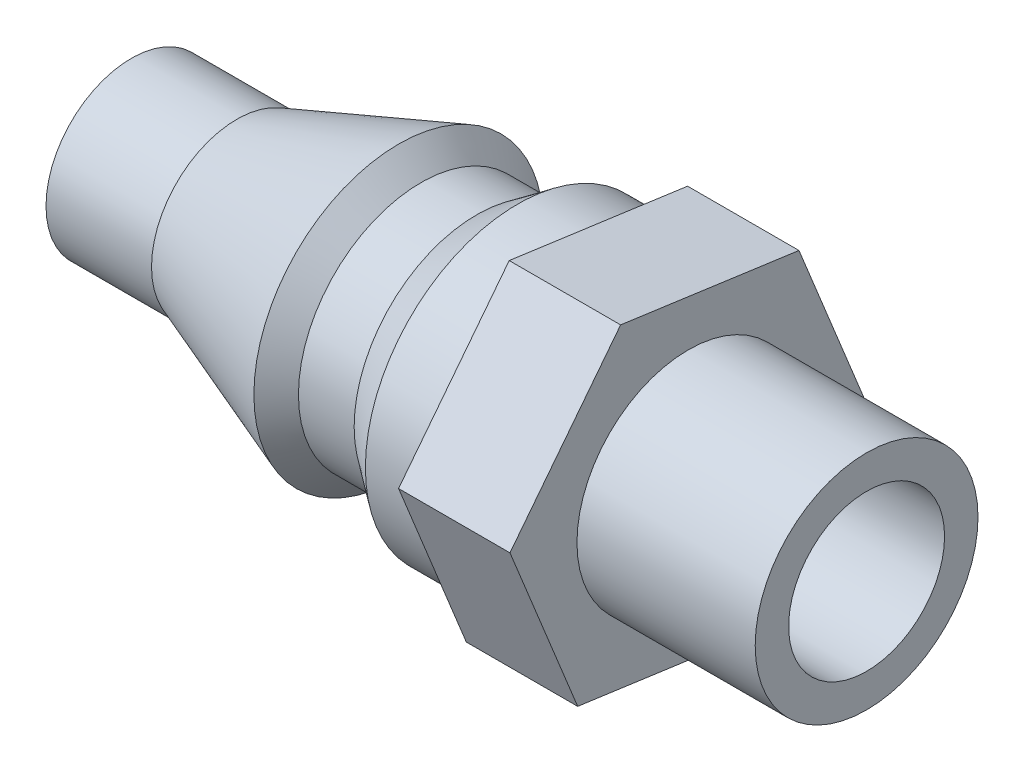
ISO-10303-21;
HEADER;
FILE_DESCRIPTION(('STEP AP214'),'2;1');
FILE_NAME('part.step','',(''),(''),'','','');
FILE_SCHEMA(('AUTOMOTIVE_DESIGN { 1 0 10303 214 1 1 1 1 }'));
ENDSEC;
DATA;
#1=APPLICATION_CONTEXT('core data for automotive mechanical design processes');
#2=APPLICATION_PROTOCOL_DEFINITION('international standard','automotive_design',2000,#1);
#3=PRODUCT_CONTEXT('',#1,'mechanical');
#4=PRODUCT('Part','Part','',(#3));
#5=PRODUCT_RELATED_PRODUCT_CATEGORY('part','',(#4));
#6=PRODUCT_DEFINITION_FORMATION('','',#4);
#7=PRODUCT_DEFINITION_CONTEXT('part definition',#1,'design');
#8=PRODUCT_DEFINITION('design','',#6,#7);
#9=PRODUCT_DEFINITION_SHAPE('','',#8);
#10=(LENGTH_UNIT() NAMED_UNIT(*) SI_UNIT(.MILLI.,.METRE.));
#11=(NAMED_UNIT(*) PLANE_ANGLE_UNIT() SI_UNIT($,.RADIAN.));
#12=(NAMED_UNIT(*) SI_UNIT($,.STERADIAN.) SOLID_ANGLE_UNIT());
#13=UNCERTAINTY_MEASURE_WITH_UNIT(LENGTH_MEASURE(1.E-05),#10,'distance_accuracy_value','');
#14=(GEOMETRIC_REPRESENTATION_CONTEXT(3) GLOBAL_UNCERTAINTY_ASSIGNED_CONTEXT((#13)) GLOBAL_UNIT_ASSIGNED_CONTEXT((#10,
#11,#12)) REPRESENTATION_CONTEXT('',''));
#15=CARTESIAN_POINT('',(0.,0.,0.));
#16=DIRECTION('',(0.,0.,1.));
#17=DIRECTION('',(1.,0.,0.));
#18=AXIS2_PLACEMENT_3D('',#15,#16,#17);
#19=CARTESIAN_POINT('',(25.,-1.11130060713787,-8.00614415895119));
#20=DIRECTION('',(1.,0.,0.));
#21=DIRECTION('',(0.,0.,-1.));
#22=AXIS2_PLACEMENT_3D('',#19,#20,#21);
#23=PLANE('',#22);
#24=DIRECTION('',(0.,0.789057262957452,-0.614319652765639));
#25=VECTOR('',#24,1.);
#26=CARTESIAN_POINT('',(25.,-7.48917453158107,-3.04065752245312));
#27=LINE('',#26,#25);
#28=CARTESIAN_POINT('',(25.,-7.48917453158107,-3.04065752245312));
#29=VERTEX_POINT('',#28);
#30=CARTESIAN_POINT('',(25.,-1.11130060713787,-8.00614415895119));
#31=VERTEX_POINT('',#30);
#32=EDGE_CURVE('E129',#29,#31,#27,.T.);
#33=ORIENTED_EDGE('',*,*,#32,.T.);
#34=DIRECTION('',(0.,0.926545056817804,0.376183808378951));
#35=VECTOR('',#34,1.);
#36=CARTESIAN_POINT('',(25.,-1.11130060713787,-8.00614415895119));
#37=LINE('',#36,#35);
#38=CARTESIAN_POINT('',(25.,6.3778739244432,-4.96548663649807));
#39=VERTEX_POINT('',#38);
#40=EDGE_CURVE('E87',#31,#39,#37,.T.);
#41=ORIENTED_EDGE('',*,*,#40,.T.);
#42=DIRECTION('',(0.,0.137487793860353,0.990503461144591));
#43=VECTOR('',#42,1.);
#44=CARTESIAN_POINT('',(25.,6.3778739244432,-4.96548663649807));
#45=LINE('',#44,#43);
#46=CARTESIAN_POINT('',(25.,7.48917453158107,3.04065752245313));
#47=VERTEX_POINT('',#46);
#48=EDGE_CURVE('E100',#39,#47,#45,.T.);
#49=ORIENTED_EDGE('',*,*,#48,.T.);
#50=DIRECTION('',(0.,-0.789057262957452,0.614319652765639));
#51=VECTOR('',#50,1.);
#52=CARTESIAN_POINT('',(25.,7.48917453158107,3.04065752245313));
#53=LINE('',#52,#51);
#54=CARTESIAN_POINT('',(25.,1.11130060713788,8.00614415895119));
#55=VERTEX_POINT('',#54);
#56=EDGE_CURVE('E94',#47,#55,#53,.T.);
#57=ORIENTED_EDGE('',*,*,#56,.T.);
#58=DIRECTION('',(0.,-0.926545056817804,-0.376183808378951));
#59=VECTOR('',#58,1.);
#60=CARTESIAN_POINT('',(25.,1.11130060713788,8.00614415895119));
#61=LINE('',#60,#59);
#62=CARTESIAN_POINT('',(25.,-6.37787392444319,4.96548663649807));
#63=VERTEX_POINT('',#62);
#64=EDGE_CURVE('E98',#55,#63,#61,.T.);
#65=ORIENTED_EDGE('',*,*,#64,.T.);
#66=DIRECTION('',(0.,-0.137487793860353,-0.99050346114459));
#67=VECTOR('',#66,1.);
#68=CARTESIAN_POINT('',(25.,-6.37787392444319,4.96548663649807));
#69=LINE('',#68,#67);
#70=EDGE_CURVE('E49',#63,#29,#69,.T.);
#71=ORIENTED_EDGE('',*,*,#70,.T.);
#72=EDGE_LOOP('',(#33,#41,#49,#57,#65,#71));
#73=FACE_BOUND('',#72,.T.);
#74=CARTESIAN_POINT('',(25.,0.,0.));
#75=DIRECTION('',(1.,0.,0.));
#76=DIRECTION('',(0.,0.,-1.));
#77=AXIS2_PLACEMENT_3D('',#74,#75,#76);
#78=CIRCLE('',#77,5.);
#79=CARTESIAN_POINT('',(25.,0.,-5.));
#80=VERTEX_POINT('',#79);
#81=EDGE_CURVE('E227',#80,#80,#78,.T.);
#82=ORIENTED_EDGE('',*,*,#81,.F.);
#83=EDGE_LOOP('',(#82));
#84=FACE_BOUND('',#83,.T.);
#85=ADVANCED_FACE('F32',(#73,#84),#23,.T.);
#86=CARTESIAN_POINT('',(0.,0.,0.));
#87=DIRECTION('',(-1.,0.,0.));
#88=DIRECTION('',(0.,0.,1.));
#89=AXIS2_PLACEMENT_3D('',#86,#87,#88);
#90=CYLINDRICAL_SURFACE('',#89,3.83046550983255);
#91=CARTESIAN_POINT('',(0.,0.,0.));
#92=DIRECTION('',(-1.,0.,0.));
#93=DIRECTION('',(0.,0.,1.));
#94=AXIS2_PLACEMENT_3D('',#91,#92,#93);
#95=CIRCLE('',#94,3.83046550983255);
#96=CARTESIAN_POINT('',(0.,0.,3.83046550983255));
#97=VERTEX_POINT('',#96);
#98=EDGE_CURVE('E141',#97,#97,#95,.T.);
#99=ORIENTED_EDGE('',*,*,#98,.F.);
#100=EDGE_LOOP('',(#99));
#101=FACE_BOUND('',#100,.T.);
#102=CARTESIAN_POINT('',(4.73589755320951,0.,0.));
#103=DIRECTION('',(-1.,0.,0.));
#104=DIRECTION('',(0.,0.,1.));
#105=AXIS2_PLACEMENT_3D('',#102,#103,#104);
#106=CIRCLE('',#105,3.83046550983255);
#107=CARTESIAN_POINT('',(4.73589755320951,0.,3.83046550983255));
#108=VERTEX_POINT('',#107);
#109=EDGE_CURVE('E11',#108,#108,#106,.T.);
#110=ORIENTED_EDGE('',*,*,#109,.T.);
#111=EDGE_LOOP('',(#110));
#112=FACE_BOUND('',#111,.T.);
#113=ADVANCED_FACE('F34',(#101,#112),#90,.T.);
#114=CARTESIAN_POINT('',(12.,0.,0.));
#115=DIRECTION('',(1.,0.,0.));
#116=DIRECTION('',(0.,0.,-1.));
#117=AXIS2_PLACEMENT_3D('',#114,#115,#116);
#118=CONICAL_SURFACE('',#117,6.5,0.352176361215014);
#119=ORIENTED_EDGE('',*,*,#109,.F.);
#120=EDGE_LOOP('',(#119));
#121=FACE_BOUND('',#120,.T.);
#122=CARTESIAN_POINT('',(12.,0.,0.));
#123=DIRECTION('',(-1.,0.,0.));
#124=DIRECTION('',(0.,0.,1.));
#125=AXIS2_PLACEMENT_3D('',#122,#123,#124);
#126=CIRCLE('',#125,6.5);
#127=CARTESIAN_POINT('',(12.,0.,6.5));
#128=VERTEX_POINT('',#127);
#129=EDGE_CURVE('E41',#128,#128,#126,.T.);
#130=ORIENTED_EDGE('',*,*,#129,.T.);
#131=EDGE_LOOP('',(#130));
#132=FACE_BOUND('',#131,.T.);
#133=ADVANCED_FACE('F155',(#121,#132),#118,.T.);
#134=CARTESIAN_POINT('',(13.,0.,0.));
#135=DIRECTION('',(-1.,0.,0.));
#136=DIRECTION('',(0.,0.,1.));
#137=AXIS2_PLACEMENT_3D('',#134,#135,#136);
#138=CONICAL_SURFACE('',#137,5.5,0.785398163397449);
#139=ORIENTED_EDGE('',*,*,#129,.F.);
#140=EDGE_LOOP('',(#139));
#141=FACE_BOUND('',#140,.T.);
#142=CARTESIAN_POINT('',(13.,0.,0.));
#143=DIRECTION('',(-1.,0.,0.));
#144=DIRECTION('',(0.,0.,1.));
#145=AXIS2_PLACEMENT_3D('',#142,#143,#144);
#146=CIRCLE('',#145,5.5);
#147=CARTESIAN_POINT('',(13.,0.,5.5));
#148=VERTEX_POINT('',#147);
#149=EDGE_CURVE('E150',#148,#148,#146,.T.);
#150=ORIENTED_EDGE('',*,*,#149,.T.);
#151=EDGE_LOOP('',(#150));
#152=FACE_BOUND('',#151,.T.);
#153=ADVANCED_FACE('F157',(#141,#152),#138,.T.);
#154=CARTESIAN_POINT('',(0.,0.,0.));
#155=DIRECTION('',(-1.,0.,0.));
#156=DIRECTION('',(0.,0.,1.));
#157=AXIS2_PLACEMENT_3D('',#154,#155,#156);
#158=CYLINDRICAL_SURFACE('',#157,5.5);
#159=ORIENTED_EDGE('',*,*,#149,.F.);
#160=EDGE_LOOP('',(#159));
#161=FACE_BOUND('',#160,.T.);
#162=CARTESIAN_POINT('',(15.5,0.,0.));
#163=DIRECTION('',(-1.,0.,0.));
#164=DIRECTION('',(0.,0.,1.));
#165=AXIS2_PLACEMENT_3D('',#162,#163,#164);
#166=CIRCLE('',#165,5.5);
#167=CARTESIAN_POINT('',(15.5,0.,5.5));
#168=VERTEX_POINT('',#167);
#169=EDGE_CURVE('E147',#168,#168,#166,.T.);
#170=ORIENTED_EDGE('',*,*,#169,.T.);
#171=EDGE_LOOP('',(#170));
#172=FACE_BOUND('',#171,.T.);
#173=ADVANCED_FACE('F160',(#161,#172),#158,.T.);
#174=CARTESIAN_POINT('',(17.3390132776685,0.,0.));
#175=DIRECTION('',(1.,0.,0.));
#176=DIRECTION('',(0.,0.,-1.));
#177=AXIS2_PLACEMENT_3D('',#174,#175,#176);
#178=CONICAL_SURFACE('',#177,6.83476724508372,0.627836431246613);
#179=ORIENTED_EDGE('',*,*,#169,.F.);
#180=EDGE_LOOP('',(#179));
#181=FACE_BOUND('',#180,.T.);
#182=CARTESIAN_POINT('',(17.3390132776685,0.,0.));
#183=DIRECTION('',(-1.,0.,0.));
#184=DIRECTION('',(0.,0.,1.));
#185=AXIS2_PLACEMENT_3D('',#182,#183,#184);
#186=CIRCLE('',#185,6.83476724508372);
#187=CARTESIAN_POINT('',(17.3390132776685,0.,6.83476724508372));
#188=VERTEX_POINT('',#187);
#189=EDGE_CURVE('E144',#188,#188,#186,.T.);
#190=ORIENTED_EDGE('',*,*,#189,.T.);
#191=EDGE_LOOP('',(#190));
#192=FACE_BOUND('',#191,.T.);
#193=ADVANCED_FACE('F166',(#181,#192),#178,.T.);
#194=CARTESIAN_POINT('',(0.,0.,0.));
#195=DIRECTION('',(-1.,0.,0.));
#196=DIRECTION('',(0.,0.,1.));
#197=AXIS2_PLACEMENT_3D('',#194,#195,#196);
#198=CYLINDRICAL_SURFACE('',#197,6.83476724508372);
#199=ORIENTED_EDGE('',*,*,#189,.F.);
#200=EDGE_LOOP('',(#199));
#201=FACE_BOUND('',#200,.T.);
#202=CARTESIAN_POINT('',(20.,0.,0.));
#203=DIRECTION('',(1.,0.,0.));
#204=DIRECTION('',(0.,0.,-1.));
#205=AXIS2_PLACEMENT_3D('',#202,#203,#204);
#206=CIRCLE('',#205,6.83476724508372);
#207=CARTESIAN_POINT('',(20.,0.,-6.83476724508372));
#208=VERTEX_POINT('',#207);
#209=EDGE_CURVE('E138',#208,#208,#206,.T.);
#210=ORIENTED_EDGE('',*,*,#209,.F.);
#211=EDGE_LOOP('',(#210));
#212=FACE_BOUND('',#211,.T.);
#213=ADVANCED_FACE('F172',(#201,#212),#198,.T.);
#214=CARTESIAN_POINT('',(0.,0.,-3.04796105332246));
#215=DIRECTION('',(1.,0.,0.));
#216=DIRECTION('',(0.,0.,-1.));
#217=AXIS2_PLACEMENT_3D('',#214,#215,#216);
#218=PLANE('',#217);
#219=CARTESIAN_POINT('',(0.,0.,0.));
#220=DIRECTION('',(1.,0.,0.));
#221=DIRECTION('',(0.,0.,-1.));
#222=AXIS2_PLACEMENT_3D('',#219,#220,#221);
#223=CIRCLE('',#222,3.5);
#224=CARTESIAN_POINT('',(0.,0.,-3.5));
#225=VERTEX_POINT('',#224);
#226=EDGE_CURVE('E222',#225,#225,#223,.T.);
#227=ORIENTED_EDGE('',*,*,#226,.T.);
#228=EDGE_LOOP('',(#227));
#229=FACE_BOUND('',#228,.T.);
#230=ORIENTED_EDGE('',*,*,#98,.T.);
#231=EDGE_LOOP('',(#230));
#232=FACE_BOUND('',#231,.T.);
#233=ADVANCED_FACE('F178',(#229,#232),#218,.F.);
#234=CARTESIAN_POINT('',(20.,-1.11130060713787,-8.00614415895119));
#235=DIRECTION('',(1.,0.,0.));
#236=DIRECTION('',(0.,0.,-1.));
#237=AXIS2_PLACEMENT_3D('',#234,#235,#236);
#238=PLANE('',#237);
#239=DIRECTION('',(0.,0.789057262957452,-0.614319652765639));
#240=VECTOR('',#239,1.);
#241=CARTESIAN_POINT('',(20.,-7.48917453158107,-3.04065752245312));
#242=LINE('',#241,#240);
#243=CARTESIAN_POINT('',(20.,-7.48917453158107,-3.04065752245312));
#244=VERTEX_POINT('',#243);
#245=CARTESIAN_POINT('',(20.,-1.11130060713787,-8.00614415895119));
#246=VERTEX_POINT('',#245);
#247=EDGE_CURVE('E118',#244,#246,#242,.T.);
#248=ORIENTED_EDGE('',*,*,#247,.F.);
#249=DIRECTION('',(0.,-0.137487793860353,-0.99050346114459));
#250=VECTOR('',#249,1.);
#251=CARTESIAN_POINT('',(20.,-6.37787392444319,4.96548663649807));
#252=LINE('',#251,#250);
#253=CARTESIAN_POINT('',(20.,-6.37787392444319,4.96548663649807));
#254=VERTEX_POINT('',#253);
#255=EDGE_CURVE('E78',#254,#244,#252,.T.);
#256=ORIENTED_EDGE('',*,*,#255,.F.);
#257=DIRECTION('',(0.,-0.926545056817804,-0.376183808378951));
#258=VECTOR('',#257,1.);
#259=CARTESIAN_POINT('',(20.,1.11130060713788,8.00614415895119));
#260=LINE('',#259,#258);
#261=CARTESIAN_POINT('',(20.,1.11130060713788,8.00614415895119));
#262=VERTEX_POINT('',#261);
#263=EDGE_CURVE('E72',#262,#254,#260,.T.);
#264=ORIENTED_EDGE('',*,*,#263,.F.);
#265=DIRECTION('',(0.,-0.789057262957452,0.614319652765639));
#266=VECTOR('',#265,1.);
#267=CARTESIAN_POINT('',(20.,7.48917453158107,3.04065752245313));
#268=LINE('',#267,#266);
#269=CARTESIAN_POINT('',(20.,7.48917453158107,3.04065752245313));
#270=VERTEX_POINT('',#269);
#271=EDGE_CURVE('E108',#270,#262,#268,.T.);
#272=ORIENTED_EDGE('',*,*,#271,.F.);
#273=DIRECTION('',(0.,0.137487793860353,0.990503461144591));
#274=VECTOR('',#273,1.);
#275=CARTESIAN_POINT('',(20.,6.3778739244432,-4.96548663649807));
#276=LINE('',#275,#274);
#277=CARTESIAN_POINT('',(20.,6.3778739244432,-4.96548663649807));
#278=VERTEX_POINT('',#277);
#279=EDGE_CURVE('E124',#278,#270,#276,.T.);
#280=ORIENTED_EDGE('',*,*,#279,.F.);
#281=DIRECTION('',(0.,0.926545056817804,0.376183808378951));
#282=VECTOR('',#281,1.);
#283=CARTESIAN_POINT('',(20.,-1.11130060713787,-8.00614415895119));
#284=LINE('',#283,#282);
#285=EDGE_CURVE('E121',#246,#278,#284,.T.);
#286=ORIENTED_EDGE('',*,*,#285,.F.);
#287=EDGE_LOOP('',(#248,#256,#264,#272,#280,#286));
#288=FACE_BOUND('',#287,.T.);
#289=ORIENTED_EDGE('',*,*,#209,.T.);
#290=EDGE_LOOP('',(#289));
#291=FACE_BOUND('',#290,.T.);
#292=ADVANCED_FACE('F182',(#288,#291),#238,.F.);
#293=CARTESIAN_POINT('',(25.,-7.48917453158107,-3.04065752245312));
#294=DIRECTION('',(0.,0.614319652765639,0.789057262957452));
#295=DIRECTION('',(0.,-0.789057262957452,0.614319652765639));
#296=AXIS2_PLACEMENT_3D('',#293,#294,#295);
#297=PLANE('',#296);
#298=ORIENTED_EDGE('',*,*,#247,.T.);
#299=DIRECTION('',(-1.,0.,0.));
#300=VECTOR('',#299,1.);
#301=CARTESIAN_POINT('',(25.,-1.11130060713787,-8.00614415895119));
#302=LINE('',#301,#300);
#303=EDGE_CURVE('E136',#31,#246,#302,.T.);
#304=ORIENTED_EDGE('',*,*,#303,.F.);
#305=ORIENTED_EDGE('',*,*,#32,.F.);
#306=DIRECTION('',(-1.,0.,0.));
#307=VECTOR('',#306,1.);
#308=CARTESIAN_POINT('',(25.,-7.48917453158107,-3.04065752245312));
#309=LINE('',#308,#307);
#310=EDGE_CURVE('E114',#29,#244,#309,.T.);
#311=ORIENTED_EDGE('',*,*,#310,.T.);
#312=EDGE_LOOP('',(#298,#304,#305,#311));
#313=FACE_BOUND('',#312,.T.);
#314=ADVANCED_FACE('F184',(#313),#297,.F.);
#315=CARTESIAN_POINT('',(25.,-1.11130060713787,-8.00614415895119));
#316=DIRECTION('',(0.,-0.376183808378951,0.926545056817805));
#317=DIRECTION('',(0.,-0.926545056817805,-0.376183808378951));
#318=AXIS2_PLACEMENT_3D('',#315,#316,#317);
#319=PLANE('',#318);
#320=ORIENTED_EDGE('',*,*,#285,.T.);
#321=DIRECTION('',(-1.,0.,0.));
#322=VECTOR('',#321,1.);
#323=CARTESIAN_POINT('',(25.,6.3778739244432,-4.96548663649807));
#324=LINE('',#323,#322);
#325=EDGE_CURVE('E133',#39,#278,#324,.T.);
#326=ORIENTED_EDGE('',*,*,#325,.F.);
#327=ORIENTED_EDGE('',*,*,#40,.F.);
#328=ORIENTED_EDGE('',*,*,#303,.T.);
#329=EDGE_LOOP('',(#320,#326,#327,#328));
#330=FACE_BOUND('',#329,.T.);
#331=ADVANCED_FACE('F191',(#330),#319,.F.);
#332=CARTESIAN_POINT('',(25.,6.3778739244432,-4.96548663649807));
#333=DIRECTION('',(0.,-0.99050346114459,0.137487793860353));
#334=DIRECTION('',(0.,-0.137487793860353,-0.99050346114459));
#335=AXIS2_PLACEMENT_3D('',#332,#333,#334);
#336=PLANE('',#335);
#337=ORIENTED_EDGE('',*,*,#279,.T.);
#338=DIRECTION('',(-1.,0.,0.));
#339=VECTOR('',#338,1.);
#340=CARTESIAN_POINT('',(25.,7.48917453158107,3.04065752245313));
#341=LINE('',#340,#339);
#342=EDGE_CURVE('E109',#47,#270,#341,.T.);
#343=ORIENTED_EDGE('',*,*,#342,.F.);
#344=ORIENTED_EDGE('',*,*,#48,.F.);
#345=ORIENTED_EDGE('',*,*,#325,.T.);
#346=EDGE_LOOP('',(#337,#343,#344,#345));
#347=FACE_BOUND('',#346,.T.);
#348=ADVANCED_FACE('F239',(#347),#336,.F.);
#349=CARTESIAN_POINT('',(25.,7.48917453158107,3.04065752245313));
#350=DIRECTION('',(0.,-0.614319652765639,-0.789057262957452));
#351=DIRECTION('',(0.,0.789057262957452,-0.614319652765639));
#352=AXIS2_PLACEMENT_3D('',#349,#350,#351);
#353=PLANE('',#352);
#354=ORIENTED_EDGE('',*,*,#271,.T.);
#355=DIRECTION('',(-1.,0.,0.));
#356=VECTOR('',#355,1.);
#357=CARTESIAN_POINT('',(25.,1.11130060713788,8.00614415895119));
#358=LINE('',#357,#356);
#359=EDGE_CURVE('E105',#55,#262,#358,.T.);
#360=ORIENTED_EDGE('',*,*,#359,.F.);
#361=ORIENTED_EDGE('',*,*,#56,.F.);
#362=ORIENTED_EDGE('',*,*,#342,.T.);
#363=EDGE_LOOP('',(#354,#360,#361,#362));
#364=FACE_BOUND('',#363,.T.);
#365=ADVANCED_FACE('F106',(#364),#353,.F.);
#366=CARTESIAN_POINT('',(25.,1.11130060713788,8.00614415895119));
#367=DIRECTION('',(0.,0.376183808378951,-0.926545056817805));
#368=DIRECTION('',(0.,0.926545056817805,0.376183808378951));
#369=AXIS2_PLACEMENT_3D('',#366,#367,#368);
#370=PLANE('',#369);
#371=ORIENTED_EDGE('',*,*,#263,.T.);
#372=DIRECTION('',(-1.,0.,0.));
#373=VECTOR('',#372,1.);
#374=CARTESIAN_POINT('',(25.,-6.37787392444319,4.96548663649807));
#375=LINE('',#374,#373);
#376=EDGE_CURVE('E110',#63,#254,#375,.T.);
#377=ORIENTED_EDGE('',*,*,#376,.F.);
#378=ORIENTED_EDGE('',*,*,#64,.F.);
#379=ORIENTED_EDGE('',*,*,#359,.T.);
#380=EDGE_LOOP('',(#371,#377,#378,#379));
#381=FACE_BOUND('',#380,.T.);
#382=ADVANCED_FACE('F112',(#381),#370,.F.);
#383=CARTESIAN_POINT('',(25.,-6.37787392444319,4.96548663649807));
#384=DIRECTION('',(0.,0.99050346114459,-0.137487793860353));
#385=DIRECTION('',(0.,0.137487793860353,0.99050346114459));
#386=AXIS2_PLACEMENT_3D('',#383,#384,#385);
#387=PLANE('',#386);
#388=ORIENTED_EDGE('',*,*,#255,.T.);
#389=ORIENTED_EDGE('',*,*,#310,.F.);
#390=ORIENTED_EDGE('',*,*,#70,.F.);
#391=ORIENTED_EDGE('',*,*,#376,.T.);
#392=EDGE_LOOP('',(#388,#389,#390,#391));
#393=FACE_BOUND('',#392,.T.);
#394=ADVANCED_FACE('F209',(#393),#387,.F.);
#395=CARTESIAN_POINT('',(33.,0.,0.));
#396=DIRECTION('',(-1.,0.,0.));
#397=DIRECTION('',(0.,0.,1.));
#398=AXIS2_PLACEMENT_3D('',#395,#396,#397);
#399=CYLINDRICAL_SURFACE('',#398,5.);
#400=CARTESIAN_POINT('',(33.,0.,0.));
#401=DIRECTION('',(1.,0.,0.));
#402=DIRECTION('',(0.,0.,-1.));
#403=AXIS2_PLACEMENT_3D('',#400,#401,#402);
#404=CIRCLE('',#403,5.);
#405=CARTESIAN_POINT('',(33.,0.,-5.));
#406=VERTEX_POINT('',#405);
#407=EDGE_CURVE('E122',#406,#406,#404,.T.);
#408=ORIENTED_EDGE('',*,*,#407,.F.);
#409=EDGE_LOOP('',(#408));
#410=FACE_BOUND('',#409,.T.);
#411=ORIENTED_EDGE('',*,*,#81,.T.);
#412=EDGE_LOOP('',(#411));
#413=FACE_BOUND('',#412,.T.);
#414=ADVANCED_FACE('F205',(#410,#413),#399,.T.);
#415=CARTESIAN_POINT('',(33.,0.,0.));
#416=DIRECTION('',(1.,0.,0.));
#417=DIRECTION('',(0.,0.,-1.));
#418=AXIS2_PLACEMENT_3D('',#415,#416,#417);
#419=PLANE('',#418);
#420=CARTESIAN_POINT('',(33.,0.,0.));
#421=DIRECTION('',(1.,0.,0.));
#422=DIRECTION('',(0.,0.,-1.));
#423=AXIS2_PLACEMENT_3D('',#420,#421,#422);
#424=CIRCLE('',#423,3.5);
#425=CARTESIAN_POINT('',(33.,0.,-3.5));
#426=VERTEX_POINT('',#425);
#427=EDGE_CURVE('E225',#426,#426,#424,.T.);
#428=ORIENTED_EDGE('',*,*,#427,.F.);
#429=EDGE_LOOP('',(#428));
#430=FACE_BOUND('',#429,.T.);
#431=ORIENTED_EDGE('',*,*,#407,.T.);
#432=EDGE_LOOP('',(#431));
#433=FACE_BOUND('',#432,.T.);
#434=ADVANCED_FACE('F208',(#430,#433),#419,.T.);
#435=CARTESIAN_POINT('',(0.,0.,0.));
#436=DIRECTION('',(1.,0.,0.));
#437=DIRECTION('',(0.,0.,-1.));
#438=AXIS2_PLACEMENT_3D('',#435,#436,#437);
#439=CYLINDRICAL_SURFACE('',#438,3.5);
#440=ORIENTED_EDGE('',*,*,#226,.F.);
#441=EDGE_LOOP('',(#440));
#442=FACE_BOUND('',#441,.T.);
#443=ORIENTED_EDGE('',*,*,#427,.T.);
#444=EDGE_LOOP('',(#443));
#445=FACE_BOUND('',#444,.T.);
#446=ADVANCED_FACE('F213',(#442,#445),#439,.F.);
#447=CLOSED_SHELL('',(#85,#113,#133,#153,#173,#193,#213,#233,#292,#314,#331,#348,#365,#382,#394,
#414,#434,#446));
#448=MANIFOLD_SOLID_BREP('B2',#447);
#449=ADVANCED_BREP_SHAPE_REPRESENTATION('',(#18,#448),#14);
#450=SHAPE_DEFINITION_REPRESENTATION(#9,#449);
ENDSEC;
END-ISO-10303-21;
